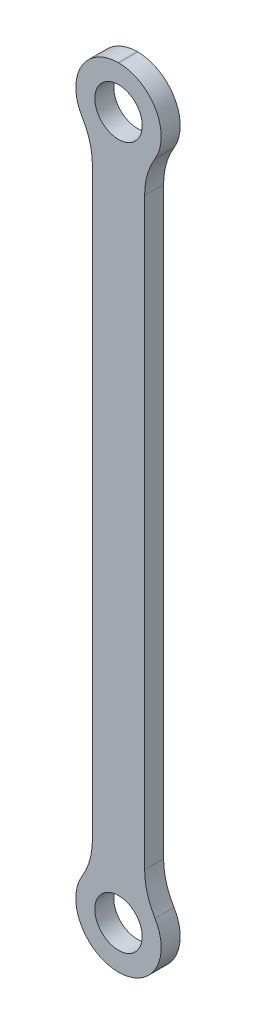
ISO-10303-21;
HEADER;
FILE_DESCRIPTION(('STEP AP214'),'2;1');
FILE_NAME('part.step','',(''),(''),'','','');
FILE_SCHEMA(('AUTOMOTIVE_DESIGN { 1 0 10303 214 1 1 1 1 }'));
ENDSEC;
DATA;
#1=APPLICATION_CONTEXT('core data for automotive mechanical design processes');
#2=APPLICATION_PROTOCOL_DEFINITION('international standard','automotive_design',2000,#1);
#3=PRODUCT_CONTEXT('',#1,'mechanical');
#4=PRODUCT('Part','Part','',(#3));
#5=PRODUCT_RELATED_PRODUCT_CATEGORY('part','',(#4));
#6=PRODUCT_DEFINITION_FORMATION('','',#4);
#7=PRODUCT_DEFINITION_CONTEXT('part definition',#1,'design');
#8=PRODUCT_DEFINITION('design','',#6,#7);
#9=PRODUCT_DEFINITION_SHAPE('','',#8);
#10=(LENGTH_UNIT() NAMED_UNIT(*) SI_UNIT(.MILLI.,.METRE.));
#11=(NAMED_UNIT(*) PLANE_ANGLE_UNIT() SI_UNIT($,.RADIAN.));
#12=(NAMED_UNIT(*) SI_UNIT($,.STERADIAN.) SOLID_ANGLE_UNIT());
#13=UNCERTAINTY_MEASURE_WITH_UNIT(LENGTH_MEASURE(1.E-05),#10,'distance_accuracy_value','');
#14=(GEOMETRIC_REPRESENTATION_CONTEXT(3) GLOBAL_UNCERTAINTY_ASSIGNED_CONTEXT((#13)) GLOBAL_UNIT_ASSIGNED_CONTEXT((#10,
#11,#12)) REPRESENTATION_CONTEXT('',''));
#15=CARTESIAN_POINT('',(0.,0.,0.));
#16=DIRECTION('',(0.,0.,1.));
#17=DIRECTION('',(1.,0.,0.));
#18=AXIS2_PLACEMENT_3D('',#15,#16,#17);
#19=CARTESIAN_POINT('',(20.4999999999997,12.4799839743487,4.));
#20=DIRECTION('',(0.,0.,1.));
#21=DIRECTION('',(1.,0.,0.));
#22=AXIS2_PLACEMENT_3D('',#19,#20,#21);
#23=PLANE('',#22);
#24=CARTESIAN_POINT('',(0.,0.,4.));
#25=DIRECTION('',(0.,0.,1.));
#26=DIRECTION('',(1.,0.,0.));
#27=AXIS2_PLACEMENT_3D('',#24,#25,#26);
#28=CIRCLE('',#27,4.99999999999989);
#29=CARTESIAN_POINT('',(4.99999999999989,0.,4.));
#30=VERTEX_POINT('',#29);
#31=EDGE_CURVE('E160',#30,#30,#28,.T.);
#32=ORIENTED_EDGE('',*,*,#31,.F.);
#33=EDGE_LOOP('',(#32));
#34=FACE_BOUND('',#33,.T.);
#35=CARTESIAN_POINT('',(20.4999999999997,12.4799839743487,4.));
#36=DIRECTION('',(0.,0.,-1.));
#37=DIRECTION('',(1.,0.,0.));
#38=AXIS2_PLACEMENT_3D('',#35,#36,#37);
#39=CIRCLE('',#38,15.0000000000001);
#40=CARTESIAN_POINT('',(7.68750000000044,4.67999399037969,4.));
#41=VERTEX_POINT('',#40);
#42=CARTESIAN_POINT('',(5.49999999999962,12.4799839743487,4.));
#43=VERTEX_POINT('',#42);
#44=EDGE_CURVE('E179',#41,#43,#39,.T.);
#45=ORIENTED_EDGE('',*,*,#44,.T.);
#46=DIRECTION('',(0.,1.,0.));
#47=VECTOR('',#46,1.);
#48=CARTESIAN_POINT('',(5.49999999999962,12.4799839743487,4.));
#49=LINE('',#48,#47);
#50=CARTESIAN_POINT('',(5.49999999999962,135.520016025651,4.));
#51=VERTEX_POINT('',#50);
#52=EDGE_CURVE('E107',#43,#51,#49,.T.);
#53=ORIENTED_EDGE('',*,*,#52,.T.);
#54=CARTESIAN_POINT('',(20.4999999999997,135.520016025648,4.));
#55=DIRECTION('',(0.,0.,-1.));
#56=DIRECTION('',(1.,0.,0.));
#57=AXIS2_PLACEMENT_3D('',#54,#55,#56);
#58=CIRCLE('',#57,15.0000000000005);
#59=CARTESIAN_POINT('',(7.68749999999974,143.320006009617,4.));
#60=VERTEX_POINT('',#59);
#61=EDGE_CURVE('E206',#51,#60,#58,.T.);
#62=ORIENTED_EDGE('',*,*,#61,.T.);
#63=CARTESIAN_POINT('',(0.,147.999999999999,4.));
#64=DIRECTION('',(0.,0.,1.));
#65=DIRECTION('',(1.,0.,0.));
#66=AXIS2_PLACEMENT_3D('',#63,#64,#65);
#67=CIRCLE('',#66,8.99999999999992);
#68=CARTESIAN_POINT('',(0.0999984567826567,156.999444444443,4.));
#69=VERTEX_POINT('',#68);
#70=EDGE_CURVE('E225',#60,#69,#67,.T.);
#71=ORIENTED_EDGE('',*,*,#70,.T.);
#72=DIRECTION('',(-1.,5.55120079042865E-13,0.));
#73=VECTOR('',#72,1.);
#74=CARTESIAN_POINT('',(-0.0999984567751078,156.999444444443,4.));
#75=LINE('',#74,#73);
#76=CARTESIAN_POINT('',(-0.0999984567751078,156.999444444443,4.));
#77=VERTEX_POINT('',#76);
#78=EDGE_CURVE('E222',#69,#77,#75,.T.);
#79=ORIENTED_EDGE('',*,*,#78,.T.);
#80=CARTESIAN_POINT('',(0.,147.999999999999,4.));
#81=DIRECTION('',(0.,0.,1.));
#82=DIRECTION('',(1.,0.,0.));
#83=AXIS2_PLACEMENT_3D('',#80,#81,#82);
#84=CIRCLE('',#83,9.00000000000012);
#85=CARTESIAN_POINT('',(-7.68749999999977,143.320006009617,4.));
#86=VERTEX_POINT('',#85);
#87=EDGE_CURVE('E224',#77,#86,#84,.T.);
#88=ORIENTED_EDGE('',*,*,#87,.T.);
#89=CARTESIAN_POINT('',(-20.5000000000002,135.52001602565,4.));
#90=DIRECTION('',(0.,0.,-1.));
#91=DIRECTION('',(1.,0.,0.));
#92=AXIS2_PLACEMENT_3D('',#89,#90,#91);
#93=CIRCLE('',#92,15.0000000000004);
#94=CARTESIAN_POINT('',(-5.5000000000006,135.520010959457,4.));
#95=VERTEX_POINT('',#94);
#96=EDGE_CURVE('E227',#86,#95,#93,.T.);
#97=ORIENTED_EDGE('',*,*,#96,.T.);
#98=DIRECTION('',(0.,-1.,0.));
#99=VECTOR('',#98,1.);
#100=CARTESIAN_POINT('',(-5.50000000000006,135.520010959457,4.));
#101=LINE('',#100,#99);
#102=CARTESIAN_POINT('',(-5.50000000000006,12.479983974348,4.));
#103=VERTEX_POINT('',#102);
#104=EDGE_CURVE('E233',#95,#103,#101,.T.);
#105=ORIENTED_EDGE('',*,*,#104,.T.);
#106=CARTESIAN_POINT('',(-20.5000000000002,12.4799839743486,4.));
#107=DIRECTION('',(0.,0.,-1.));
#108=DIRECTION('',(1.,0.,0.));
#109=AXIS2_PLACEMENT_3D('',#106,#107,#108);
#110=CIRCLE('',#109,15.);
#111=CARTESIAN_POINT('',(-7.68749999999975,4.67999399038134,4.));
#112=VERTEX_POINT('',#111);
#113=EDGE_CURVE('E138',#103,#112,#110,.T.);
#114=ORIENTED_EDGE('',*,*,#113,.T.);
#115=CARTESIAN_POINT('',(0.,0.,4.));
#116=DIRECTION('',(0.,0.,1.));
#117=DIRECTION('',(1.,0.,0.));
#118=AXIS2_PLACEMENT_3D('',#115,#116,#117);
#119=CIRCLE('',#118,9.0000000000001);
#120=CARTESIAN_POINT('',(-0.0999984567751144,-8.99944444444458,4.));
#121=VERTEX_POINT('',#120);
#122=EDGE_CURVE('E132',#112,#121,#119,.T.);
#123=ORIENTED_EDGE('',*,*,#122,.T.);
#124=DIRECTION('',(1.,4.85730069162507E-13,0.));
#125=VECTOR('',#124,1.);
#126=CARTESIAN_POINT('',(0.0999984567826573,-8.99944444444439,4.));
#127=LINE('',#126,#125);
#128=CARTESIAN_POINT('',(0.0999984567826573,-8.99944444444439,4.));
#129=VERTEX_POINT('',#128);
#130=EDGE_CURVE('E136',#121,#129,#127,.T.);
#131=ORIENTED_EDGE('',*,*,#130,.T.);
#132=CARTESIAN_POINT('',(0.,0.,4.));
#133=DIRECTION('',(0.,0.,1.));
#134=DIRECTION('',(1.,0.,0.));
#135=AXIS2_PLACEMENT_3D('',#132,#133,#134);
#136=CIRCLE('',#135,8.99999999999982);
#137=EDGE_CURVE('E52',#129,#41,#136,.T.);
#138=ORIENTED_EDGE('',*,*,#137,.T.);
#139=EDGE_LOOP('',(#45,#53,#62,#71,#79,#88,#97,#105,#114,#123,#131,#138));
#140=FACE_BOUND('',#139,.T.);
#141=CARTESIAN_POINT('',(0.,147.999999999999,4.));
#142=DIRECTION('',(0.,0.,1.));
#143=DIRECTION('',(1.,0.,0.));
#144=AXIS2_PLACEMENT_3D('',#141,#142,#143);
#145=CIRCLE('',#144,4.99999999999989);
#146=CARTESIAN_POINT('',(4.99999999999989,147.999999999999,4.));
#147=VERTEX_POINT('',#146);
#148=EDGE_CURVE('E276',#147,#147,#145,.T.);
#149=ORIENTED_EDGE('',*,*,#148,.F.);
#150=EDGE_LOOP('',(#149));
#151=FACE_BOUND('',#150,.T.);
#152=ADVANCED_FACE('F35',(#34,#140,#151),#23,.T.);
#153=CARTESIAN_POINT('',(20.4999999999997,12.4799839743487,0.));
#154=DIRECTION('',(0.,0.,1.));
#155=DIRECTION('',(1.,0.,0.));
#156=AXIS2_PLACEMENT_3D('',#153,#154,#155);
#157=PLANE('',#156);
#158=CARTESIAN_POINT('',(0.,0.,0.));
#159=DIRECTION('',(0.,0.,1.));
#160=DIRECTION('',(1.,0.,0.));
#161=AXIS2_PLACEMENT_3D('',#158,#159,#160);
#162=CIRCLE('',#161,4.99999999999989);
#163=CARTESIAN_POINT('',(4.99999999999989,0.,0.));
#164=VERTEX_POINT('',#163);
#165=EDGE_CURVE('E281',#164,#164,#162,.T.);
#166=ORIENTED_EDGE('',*,*,#165,.T.);
#167=EDGE_LOOP('',(#166));
#168=FACE_BOUND('',#167,.T.);
#169=CARTESIAN_POINT('',(20.4999999999997,12.4799839743487,0.));
#170=DIRECTION('',(0.,0.,-1.));
#171=DIRECTION('',(1.,0.,0.));
#172=AXIS2_PLACEMENT_3D('',#169,#170,#171);
#173=CIRCLE('',#172,15.0000000000001);
#174=CARTESIAN_POINT('',(7.68750000000044,4.67999399037969,0.));
#175=VERTEX_POINT('',#174);
#176=CARTESIAN_POINT('',(5.49999999999962,12.4799839743487,0.));
#177=VERTEX_POINT('',#176);
#178=EDGE_CURVE('E156',#175,#177,#173,.T.);
#179=ORIENTED_EDGE('',*,*,#178,.F.);
#180=CARTESIAN_POINT('',(0.,0.,0.));
#181=DIRECTION('',(0.,0.,1.));
#182=DIRECTION('',(1.,0.,0.));
#183=AXIS2_PLACEMENT_3D('',#180,#181,#182);
#184=CIRCLE('',#183,8.99999999999982);
#185=CARTESIAN_POINT('',(0.0999984567826573,-8.99944444444439,0.));
#186=VERTEX_POINT('',#185);
#187=EDGE_CURVE('E99',#186,#175,#184,.T.);
#188=ORIENTED_EDGE('',*,*,#187,.F.);
#189=DIRECTION('',(1.,4.85730069162507E-13,0.));
#190=VECTOR('',#189,1.);
#191=CARTESIAN_POINT('',(0.0999984567826573,-8.99944444444439,0.));
#192=LINE('',#191,#190);
#193=CARTESIAN_POINT('',(-0.0999984567751144,-8.99944444444458,0.));
#194=VERTEX_POINT('',#193);
#195=EDGE_CURVE('E93',#194,#186,#192,.T.);
#196=ORIENTED_EDGE('',*,*,#195,.F.);
#197=CARTESIAN_POINT('',(0.,0.,0.));
#198=DIRECTION('',(0.,0.,1.));
#199=DIRECTION('',(1.,0.,0.));
#200=AXIS2_PLACEMENT_3D('',#197,#198,#199);
#201=CIRCLE('',#200,9.0000000000001);
#202=CARTESIAN_POINT('',(-7.68749999999975,4.67999399038134,0.));
#203=VERTEX_POINT('',#202);
#204=EDGE_CURVE('E146',#203,#194,#201,.T.);
#205=ORIENTED_EDGE('',*,*,#204,.F.);
#206=CARTESIAN_POINT('',(-20.5000000000002,12.4799839743486,0.));
#207=DIRECTION('',(0.,0.,-1.));
#208=DIRECTION('',(1.,0.,0.));
#209=AXIS2_PLACEMENT_3D('',#206,#207,#208);
#210=CIRCLE('',#209,15.);
#211=CARTESIAN_POINT('',(-5.50000000000006,12.479983974348,0.));
#212=VERTEX_POINT('',#211);
#213=EDGE_CURVE('E174',#212,#203,#210,.T.);
#214=ORIENTED_EDGE('',*,*,#213,.F.);
#215=DIRECTION('',(0.,-1.,0.));
#216=VECTOR('',#215,1.);
#217=CARTESIAN_POINT('',(-5.50000000000006,135.520010959457,0.));
#218=LINE('',#217,#216);
#219=CARTESIAN_POINT('',(-5.5000000000006,135.520010959457,0.));
#220=VERTEX_POINT('',#219);
#221=EDGE_CURVE('E172',#220,#212,#218,.T.);
#222=ORIENTED_EDGE('',*,*,#221,.F.);
#223=CARTESIAN_POINT('',(-20.5000000000002,135.52001602565,0.));
#224=DIRECTION('',(0.,0.,-1.));
#225=DIRECTION('',(1.,0.,0.));
#226=AXIS2_PLACEMENT_3D('',#223,#224,#225);
#227=CIRCLE('',#226,15.0000000000004);
#228=CARTESIAN_POINT('',(-7.68749999999977,143.320006009617,0.));
#229=VERTEX_POINT('',#228);
#230=EDGE_CURVE('E170',#229,#220,#227,.T.);
#231=ORIENTED_EDGE('',*,*,#230,.F.);
#232=CARTESIAN_POINT('',(0.,147.999999999999,0.));
#233=DIRECTION('',(0.,0.,1.));
#234=DIRECTION('',(1.,0.,0.));
#235=AXIS2_PLACEMENT_3D('',#232,#233,#234);
#236=CIRCLE('',#235,9.00000000000012);
#237=CARTESIAN_POINT('',(-0.0999984567751078,156.999444444443,0.));
#238=VERTEX_POINT('',#237);
#239=EDGE_CURVE('E168',#238,#229,#236,.T.);
#240=ORIENTED_EDGE('',*,*,#239,.F.);
#241=DIRECTION('',(-1.,5.55120079042865E-13,0.));
#242=VECTOR('',#241,1.);
#243=CARTESIAN_POINT('',(-0.0999984567751078,156.999444444443,0.));
#244=LINE('',#243,#242);
#245=CARTESIAN_POINT('',(0.0999984567826567,156.999444444443,0.));
#246=VERTEX_POINT('',#245);
#247=EDGE_CURVE('E166',#246,#238,#244,.T.);
#248=ORIENTED_EDGE('',*,*,#247,.F.);
#249=CARTESIAN_POINT('',(0.,147.999999999999,0.));
#250=DIRECTION('',(0.,0.,1.));
#251=DIRECTION('',(1.,0.,0.));
#252=AXIS2_PLACEMENT_3D('',#249,#250,#251);
#253=CIRCLE('',#252,8.99999999999992);
#254=CARTESIAN_POINT('',(7.68749999999974,143.320006009617,0.));
#255=VERTEX_POINT('',#254);
#256=EDGE_CURVE('E164',#255,#246,#253,.T.);
#257=ORIENTED_EDGE('',*,*,#256,.F.);
#258=CARTESIAN_POINT('',(20.4999999999997,135.520016025648,0.));
#259=DIRECTION('',(0.,0.,-1.));
#260=DIRECTION('',(1.,0.,0.));
#261=AXIS2_PLACEMENT_3D('',#258,#259,#260);
#262=CIRCLE('',#261,15.0000000000005);
#263=CARTESIAN_POINT('',(5.49999999999962,135.520016025651,0.));
#264=VERTEX_POINT('',#263);
#265=EDGE_CURVE('E162',#264,#255,#262,.T.);
#266=ORIENTED_EDGE('',*,*,#265,.F.);
#267=DIRECTION('',(0.,1.,0.));
#268=VECTOR('',#267,1.);
#269=CARTESIAN_POINT('',(5.49999999999962,12.4799839743487,0.));
#270=LINE('',#269,#268);
#271=EDGE_CURVE('E159',#177,#264,#270,.T.);
#272=ORIENTED_EDGE('',*,*,#271,.F.);
#273=EDGE_LOOP('',(#179,#188,#196,#205,#214,#222,#231,#240,#248,#257,#266,#272));
#274=FACE_BOUND('',#273,.T.);
#275=CARTESIAN_POINT('',(0.,147.999999999999,0.));
#276=DIRECTION('',(0.,0.,1.));
#277=DIRECTION('',(1.,0.,0.));
#278=AXIS2_PLACEMENT_3D('',#275,#276,#277);
#279=CIRCLE('',#278,4.99999999999989);
#280=CARTESIAN_POINT('',(4.99999999999989,147.999999999999,0.));
#281=VERTEX_POINT('',#280);
#282=EDGE_CURVE('E279',#281,#281,#279,.T.);
#283=ORIENTED_EDGE('',*,*,#282,.T.);
#284=EDGE_LOOP('',(#283));
#285=FACE_BOUND('',#284,.T.);
#286=ADVANCED_FACE('F210',(#168,#274,#285),#157,.F.);
#287=CARTESIAN_POINT('',(20.4999999999997,12.4799839743487,4.));
#288=DIRECTION('',(0.,0.,-1.));
#289=DIRECTION('',(-1.,0.,0.));
#290=AXIS2_PLACEMENT_3D('',#287,#288,#289);
#291=CYLINDRICAL_SURFACE('',#290,15.0000000000001);
#292=ORIENTED_EDGE('',*,*,#178,.T.);
#293=DIRECTION('',(0.,0.,-1.));
#294=VECTOR('',#293,1.);
#295=CARTESIAN_POINT('',(5.49999999999962,12.4799839743487,4.));
#296=LINE('',#295,#294);
#297=EDGE_CURVE('E11',#43,#177,#296,.T.);
#298=ORIENTED_EDGE('',*,*,#297,.F.);
#299=ORIENTED_EDGE('',*,*,#44,.F.);
#300=DIRECTION('',(0.,0.,-1.));
#301=VECTOR('',#300,1.);
#302=CARTESIAN_POINT('',(7.68750000000044,4.67999399037969,4.));
#303=LINE('',#302,#301);
#304=EDGE_CURVE('E152',#41,#175,#303,.T.);
#305=ORIENTED_EDGE('',*,*,#304,.T.);
#306=EDGE_LOOP('',(#292,#298,#299,#305));
#307=FACE_BOUND('',#306,.T.);
#308=ADVANCED_FACE('F37',(#307),#291,.F.);
#309=CARTESIAN_POINT('',(5.49999999999962,12.4799839743487,4.));
#310=DIRECTION('',(-1.,0.,0.));
#311=DIRECTION('',(0.,0.,1.));
#312=AXIS2_PLACEMENT_3D('',#309,#310,#311);
#313=PLANE('',#312);
#314=ORIENTED_EDGE('',*,*,#271,.T.);
#315=DIRECTION('',(0.,0.,-1.));
#316=VECTOR('',#315,1.);
#317=CARTESIAN_POINT('',(5.49999999999962,135.520016025651,4.));
#318=LINE('',#317,#316);
#319=EDGE_CURVE('E44',#51,#264,#318,.T.);
#320=ORIENTED_EDGE('',*,*,#319,.F.);
#321=ORIENTED_EDGE('',*,*,#52,.F.);
#322=ORIENTED_EDGE('',*,*,#297,.T.);
#323=EDGE_LOOP('',(#314,#320,#321,#322));
#324=FACE_BOUND('',#323,.T.);
#325=ADVANCED_FACE('F374',(#324),#313,.F.);
#326=CARTESIAN_POINT('',(20.4999999999997,135.520016025648,4.));
#327=DIRECTION('',(0.,0.,-1.));
#328=DIRECTION('',(-1.,0.,0.));
#329=AXIS2_PLACEMENT_3D('',#326,#327,#328);
#330=CYLINDRICAL_SURFACE('',#329,15.0000000000005);
#331=ORIENTED_EDGE('',*,*,#265,.T.);
#332=DIRECTION('',(0.,0.,-1.));
#333=VECTOR('',#332,1.);
#334=CARTESIAN_POINT('',(7.68749999999974,143.320006009617,4.));
#335=LINE('',#334,#333);
#336=EDGE_CURVE('E198',#60,#255,#335,.T.);
#337=ORIENTED_EDGE('',*,*,#336,.F.);
#338=ORIENTED_EDGE('',*,*,#61,.F.);
#339=ORIENTED_EDGE('',*,*,#319,.T.);
#340=EDGE_LOOP('',(#331,#337,#338,#339));
#341=FACE_BOUND('',#340,.T.);
#342=ADVANCED_FACE('F204',(#341),#330,.F.);
#343=CARTESIAN_POINT('',(0.,147.999999999999,4.));
#344=DIRECTION('',(0.,0.,-1.));
#345=DIRECTION('',(-1.,0.,0.));
#346=AXIS2_PLACEMENT_3D('',#343,#344,#345);
#347=CYLINDRICAL_SURFACE('',#346,8.99999999999992);
#348=ORIENTED_EDGE('',*,*,#256,.T.);
#349=DIRECTION('',(0.,0.,-1.));
#350=VECTOR('',#349,1.);
#351=CARTESIAN_POINT('',(0.0999984567826567,156.999444444443,4.));
#352=LINE('',#351,#350);
#353=EDGE_CURVE('E195',#69,#246,#352,.T.);
#354=ORIENTED_EDGE('',*,*,#353,.F.);
#355=ORIENTED_EDGE('',*,*,#70,.F.);
#356=ORIENTED_EDGE('',*,*,#336,.T.);
#357=EDGE_LOOP('',(#348,#354,#355,#356));
#358=FACE_BOUND('',#357,.T.);
#359=ADVANCED_FACE('F216',(#358),#347,.T.);
#360=CARTESIAN_POINT('',(-0.0999984567751078,156.999444444443,4.));
#361=DIRECTION('',(-5.55120079042865E-13,-1.,0.));
#362=DIRECTION('',(1.,-5.55120079042865E-13,0.));
#363=AXIS2_PLACEMENT_3D('',#360,#361,#362);
#364=PLANE('',#363);
#365=ORIENTED_EDGE('',*,*,#247,.T.);
#366=DIRECTION('',(0.,0.,-1.));
#367=VECTOR('',#366,1.);
#368=CARTESIAN_POINT('',(-0.0999984567751078,156.999444444443,4.));
#369=LINE('',#368,#367);
#370=EDGE_CURVE('E192',#77,#238,#369,.T.);
#371=ORIENTED_EDGE('',*,*,#370,.F.);
#372=ORIENTED_EDGE('',*,*,#78,.F.);
#373=ORIENTED_EDGE('',*,*,#353,.T.);
#374=EDGE_LOOP('',(#365,#371,#372,#373));
#375=FACE_BOUND('',#374,.T.);
#376=ADVANCED_FACE('F220',(#375),#364,.F.);
#377=CARTESIAN_POINT('',(0.,147.999999999999,4.));
#378=DIRECTION('',(0.,0.,-1.));
#379=DIRECTION('',(-1.,0.,0.));
#380=AXIS2_PLACEMENT_3D('',#377,#378,#379);
#381=CYLINDRICAL_SURFACE('',#380,9.00000000000012);
#382=ORIENTED_EDGE('',*,*,#239,.T.);
#383=DIRECTION('',(0.,0.,-1.));
#384=VECTOR('',#383,1.);
#385=CARTESIAN_POINT('',(-7.68749999999977,143.320006009617,4.));
#386=LINE('',#385,#384);
#387=EDGE_CURVE('E189',#86,#229,#386,.T.);
#388=ORIENTED_EDGE('',*,*,#387,.F.);
#389=ORIENTED_EDGE('',*,*,#87,.F.);
#390=ORIENTED_EDGE('',*,*,#370,.T.);
#391=EDGE_LOOP('',(#382,#388,#389,#390));
#392=FACE_BOUND('',#391,.T.);
#393=ADVANCED_FACE('F339',(#392),#381,.T.);
#394=CARTESIAN_POINT('',(-20.5000000000002,135.52001602565,4.));
#395=DIRECTION('',(0.,0.,-1.));
#396=DIRECTION('',(-1.,0.,0.));
#397=AXIS2_PLACEMENT_3D('',#394,#395,#396);
#398=CYLINDRICAL_SURFACE('',#397,15.0000000000004);
#399=ORIENTED_EDGE('',*,*,#230,.T.);
#400=DIRECTION('',(0.,0.,-1.));
#401=VECTOR('',#400,1.);
#402=CARTESIAN_POINT('',(-5.5000000000006,135.520010959457,4.));
#403=LINE('',#402,#401);
#404=EDGE_CURVE('E186',#95,#220,#403,.T.);
#405=ORIENTED_EDGE('',*,*,#404,.F.);
#406=ORIENTED_EDGE('',*,*,#96,.F.);
#407=ORIENTED_EDGE('',*,*,#387,.T.);
#408=EDGE_LOOP('',(#399,#405,#406,#407));
#409=FACE_BOUND('',#408,.T.);
#410=ADVANCED_FACE('F330',(#409),#398,.F.);
#411=CARTESIAN_POINT('',(-5.50000000000006,135.520010959457,4.));
#412=DIRECTION('',(1.,0.,0.));
#413=DIRECTION('',(0.,0.,-1.));
#414=AXIS2_PLACEMENT_3D('',#411,#412,#413);
#415=PLANE('',#414);
#416=ORIENTED_EDGE('',*,*,#221,.T.);
#417=DIRECTION('',(0.,0.,-1.));
#418=VECTOR('',#417,1.);
#419=CARTESIAN_POINT('',(-5.50000000000006,12.479983974348,4.));
#420=LINE('',#419,#418);
#421=EDGE_CURVE('E183',#103,#212,#420,.T.);
#422=ORIENTED_EDGE('',*,*,#421,.F.);
#423=ORIENTED_EDGE('',*,*,#104,.F.);
#424=ORIENTED_EDGE('',*,*,#404,.T.);
#425=EDGE_LOOP('',(#416,#422,#423,#424));
#426=FACE_BOUND('',#425,.T.);
#427=ADVANCED_FACE('F239',(#426),#415,.F.);
#428=CARTESIAN_POINT('',(-20.5000000000002,12.4799839743486,4.));
#429=DIRECTION('',(0.,0.,-1.));
#430=DIRECTION('',(-1.,0.,0.));
#431=AXIS2_PLACEMENT_3D('',#428,#429,#430);
#432=CYLINDRICAL_SURFACE('',#431,15.);
#433=ORIENTED_EDGE('',*,*,#213,.T.);
#434=DIRECTION('',(0.,0.,-1.));
#435=VECTOR('',#434,1.);
#436=CARTESIAN_POINT('',(-7.68749999999975,4.67999399038134,4.));
#437=LINE('',#436,#435);
#438=EDGE_CURVE('E147',#112,#203,#437,.T.);
#439=ORIENTED_EDGE('',*,*,#438,.F.);
#440=ORIENTED_EDGE('',*,*,#113,.F.);
#441=ORIENTED_EDGE('',*,*,#421,.T.);
#442=EDGE_LOOP('',(#433,#439,#440,#441));
#443=FACE_BOUND('',#442,.T.);
#444=ADVANCED_FACE('F243',(#443),#432,.F.);
#445=CARTESIAN_POINT('',(0.,0.,4.));
#446=DIRECTION('',(0.,0.,-1.));
#447=DIRECTION('',(-1.,0.,0.));
#448=AXIS2_PLACEMENT_3D('',#445,#446,#447);
#449=CYLINDRICAL_SURFACE('',#448,9.0000000000001);
#450=ORIENTED_EDGE('',*,*,#204,.T.);
#451=DIRECTION('',(0.,0.,-1.));
#452=VECTOR('',#451,1.);
#453=CARTESIAN_POINT('',(-0.0999984567751144,-8.99944444444458,4.));
#454=LINE('',#453,#452);
#455=EDGE_CURVE('E143',#121,#194,#454,.T.);
#456=ORIENTED_EDGE('',*,*,#455,.F.);
#457=ORIENTED_EDGE('',*,*,#122,.F.);
#458=ORIENTED_EDGE('',*,*,#438,.T.);
#459=EDGE_LOOP('',(#450,#456,#457,#458));
#460=FACE_BOUND('',#459,.T.);
#461=ADVANCED_FACE('F144',(#460),#449,.T.);
#462=CARTESIAN_POINT('',(0.0999984567826573,-8.99944444444439,4.));
#463=DIRECTION('',(-4.85730069162507E-13,1.,0.));
#464=DIRECTION('',(-1.,-4.85730069162507E-13,0.));
#465=AXIS2_PLACEMENT_3D('',#462,#463,#464);
#466=PLANE('',#465);
#467=ORIENTED_EDGE('',*,*,#195,.T.);
#468=DIRECTION('',(0.,0.,-1.));
#469=VECTOR('',#468,1.);
#470=CARTESIAN_POINT('',(0.0999984567826573,-8.99944444444439,4.));
#471=LINE('',#470,#469);
#472=EDGE_CURVE('E148',#129,#186,#471,.T.);
#473=ORIENTED_EDGE('',*,*,#472,.F.);
#474=ORIENTED_EDGE('',*,*,#130,.F.);
#475=ORIENTED_EDGE('',*,*,#455,.T.);
#476=EDGE_LOOP('',(#467,#473,#474,#475));
#477=FACE_BOUND('',#476,.T.);
#478=ADVANCED_FACE('F150',(#477),#466,.F.);
#479=CARTESIAN_POINT('',(0.,0.,4.));
#480=DIRECTION('',(0.,0.,-1.));
#481=DIRECTION('',(-1.,0.,0.));
#482=AXIS2_PLACEMENT_3D('',#479,#480,#481);
#483=CYLINDRICAL_SURFACE('',#482,8.99999999999982);
#484=ORIENTED_EDGE('',*,*,#187,.T.);
#485=ORIENTED_EDGE('',*,*,#304,.F.);
#486=ORIENTED_EDGE('',*,*,#137,.F.);
#487=ORIENTED_EDGE('',*,*,#472,.T.);
#488=EDGE_LOOP('',(#484,#485,#486,#487));
#489=FACE_BOUND('',#488,.T.);
#490=ADVANCED_FACE('F247',(#489),#483,.T.);
#491=CARTESIAN_POINT('',(0.,0.,4.));
#492=DIRECTION('',(0.,0.,-1.));
#493=DIRECTION('',(-1.,0.,0.));
#494=AXIS2_PLACEMENT_3D('',#491,#492,#493);
#495=CYLINDRICAL_SURFACE('',#494,4.99999999999989);
#496=ORIENTED_EDGE('',*,*,#31,.T.);
#497=EDGE_LOOP('',(#496));
#498=FACE_BOUND('',#497,.T.);
#499=ORIENTED_EDGE('',*,*,#165,.F.);
#500=EDGE_LOOP('',(#499));
#501=FACE_BOUND('',#500,.T.);
#502=ADVANCED_FACE('F249',(#498,#501),#495,.F.);
#503=CARTESIAN_POINT('',(0.,147.999999999999,4.));
#504=DIRECTION('',(0.,0.,-1.));
#505=DIRECTION('',(-1.,0.,0.));
#506=AXIS2_PLACEMENT_3D('',#503,#504,#505);
#507=CYLINDRICAL_SURFACE('',#506,4.99999999999989);
#508=ORIENTED_EDGE('',*,*,#148,.T.);
#509=EDGE_LOOP('',(#508));
#510=FACE_BOUND('',#509,.T.);
#511=ORIENTED_EDGE('',*,*,#282,.F.);
#512=EDGE_LOOP('',(#511));
#513=FACE_BOUND('',#512,.T.);
#514=ADVANCED_FACE('F255',(#510,#513),#507,.F.);
#515=CLOSED_SHELL('',(#152,#286,#308,#325,#342,#359,#376,#393,#410,#427,#444,#461,#478,#490,
#502,#514));
#516=MANIFOLD_SOLID_BREP('B2',#515);
#517=ADVANCED_BREP_SHAPE_REPRESENTATION('',(#18,#516),#14);
#518=SHAPE_DEFINITION_REPRESENTATION(#9,#517);
ENDSEC;
END-ISO-10303-21;
